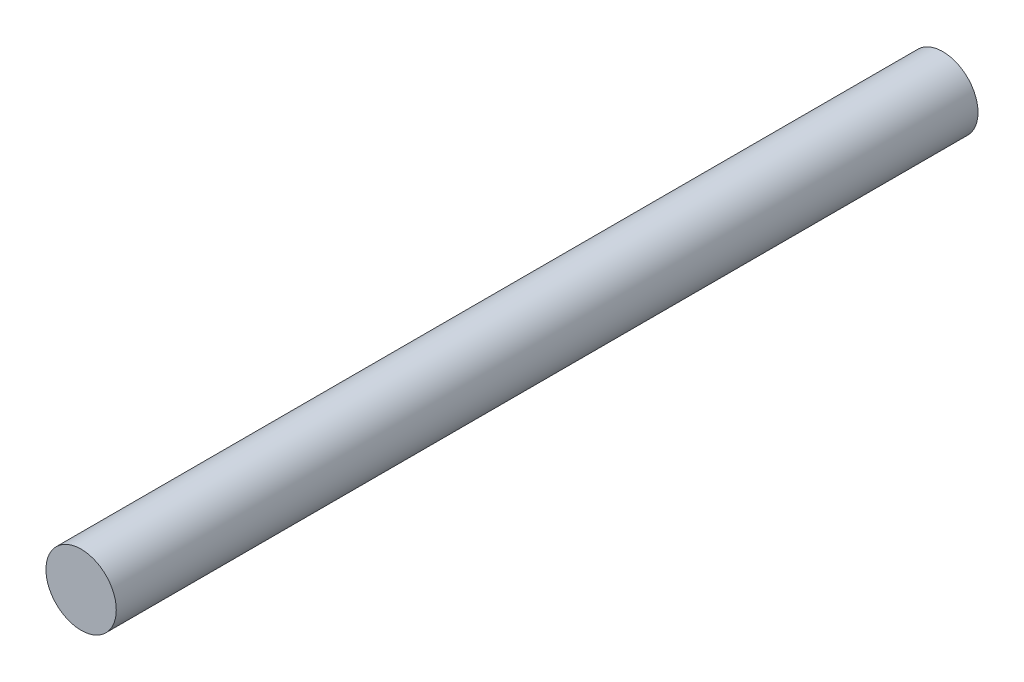
ISO-10303-21;
HEADER;
FILE_DESCRIPTION(('STEP AP214'),'2;1');
FILE_NAME('part.step','',(''),(''),'','','');
FILE_SCHEMA(('AUTOMOTIVE_DESIGN { 1 0 10303 214 1 1 1 1 }'));
ENDSEC;
DATA;
#1=APPLICATION_CONTEXT('core data for automotive mechanical design processes');
#2=APPLICATION_PROTOCOL_DEFINITION('international standard','automotive_design',2000,#1);
#3=PRODUCT_CONTEXT('',#1,'mechanical');
#4=PRODUCT('Part','Part','',(#3));
#5=PRODUCT_RELATED_PRODUCT_CATEGORY('part','',(#4));
#6=PRODUCT_DEFINITION_FORMATION('','',#4);
#7=PRODUCT_DEFINITION_CONTEXT('part definition',#1,'design');
#8=PRODUCT_DEFINITION('design','',#6,#7);
#9=PRODUCT_DEFINITION_SHAPE('','',#8);
#10=(LENGTH_UNIT() NAMED_UNIT(*) SI_UNIT(.MILLI.,.METRE.));
#11=(NAMED_UNIT(*) PLANE_ANGLE_UNIT() SI_UNIT($,.RADIAN.));
#12=(NAMED_UNIT(*) SI_UNIT($,.STERADIAN.) SOLID_ANGLE_UNIT());
#13=UNCERTAINTY_MEASURE_WITH_UNIT(LENGTH_MEASURE(1.E-05),#10,'distance_accuracy_value','');
#14=(GEOMETRIC_REPRESENTATION_CONTEXT(3) GLOBAL_UNCERTAINTY_ASSIGNED_CONTEXT((#13)) GLOBAL_UNIT_ASSIGNED_CONTEXT((#10,
#11,#12)) REPRESENTATION_CONTEXT('',''));
#15=CARTESIAN_POINT('',(0.,0.,0.));
#16=DIRECTION('',(0.,0.,1.));
#17=DIRECTION('',(1.,0.,0.));
#18=AXIS2_PLACEMENT_3D('',#15,#16,#17);
#19=CARTESIAN_POINT('',(0.,0.,49.));
#20=DIRECTION('',(0.,0.,-1.));
#21=DIRECTION('',(-1.,0.,0.));
#22=AXIS2_PLACEMENT_3D('',#19,#20,#21);
#23=CYLINDRICAL_SURFACE('',#22,4.);
#24=CARTESIAN_POINT('',(0.,0.,49.));
#25=DIRECTION('',(0.,0.,1.));
#26=DIRECTION('',(1.,0.,0.));
#27=AXIS2_PLACEMENT_3D('',#24,#25,#26);
#28=CIRCLE('',#27,4.);
#29=CARTESIAN_POINT('',(4.,0.,49.));
#30=VERTEX_POINT('',#29);
#31=EDGE_CURVE('E10',#30,#30,#28,.T.);
#32=ORIENTED_EDGE('',*,*,#31,.F.);
#33=EDGE_LOOP('',(#32));
#34=FACE_BOUND('',#33,.T.);
#35=CARTESIAN_POINT('',(0.,0.,-49.));
#36=DIRECTION('',(0.,0.,1.));
#37=DIRECTION('',(1.,0.,0.));
#38=AXIS2_PLACEMENT_3D('',#35,#36,#37);
#39=CIRCLE('',#38,4.);
#40=CARTESIAN_POINT('',(4.,0.,-49.));
#41=VERTEX_POINT('',#40);
#42=EDGE_CURVE('E40',#41,#41,#39,.T.);
#43=ORIENTED_EDGE('',*,*,#42,.T.);
#44=EDGE_LOOP('',(#43));
#45=FACE_BOUND('',#44,.T.);
#46=ADVANCED_FACE('F37',(#34,#45),#23,.T.);
#47=CARTESIAN_POINT('',(0.,0.,49.));
#48=DIRECTION('',(0.,0.,1.));
#49=DIRECTION('',(1.,0.,0.));
#50=AXIS2_PLACEMENT_3D('',#47,#48,#49);
#51=PLANE('',#50);
#52=ORIENTED_EDGE('',*,*,#31,.T.);
#53=EDGE_LOOP('',(#52));
#54=FACE_BOUND('',#53,.T.);
#55=ADVANCED_FACE('F52',(#54),#51,.T.);
#56=CARTESIAN_POINT('',(0.,0.,-49.));
#57=DIRECTION('',(0.,0.,1.));
#58=DIRECTION('',(1.,0.,0.));
#59=AXIS2_PLACEMENT_3D('',#56,#57,#58);
#60=PLANE('',#59);
#61=ORIENTED_EDGE('',*,*,#42,.F.);
#62=EDGE_LOOP('',(#61));
#63=FACE_BOUND('',#62,.T.);
#64=ADVANCED_FACE('F50',(#63),#60,.F.);
#65=CLOSED_SHELL('',(#46,#55,#64));
#66=MANIFOLD_SOLID_BREP('B2',#65);
#67=ADVANCED_BREP_SHAPE_REPRESENTATION('',(#18,#66),#14);
#68=SHAPE_DEFINITION_REPRESENTATION(#9,#67);
ENDSEC;
END-ISO-10303-21;
